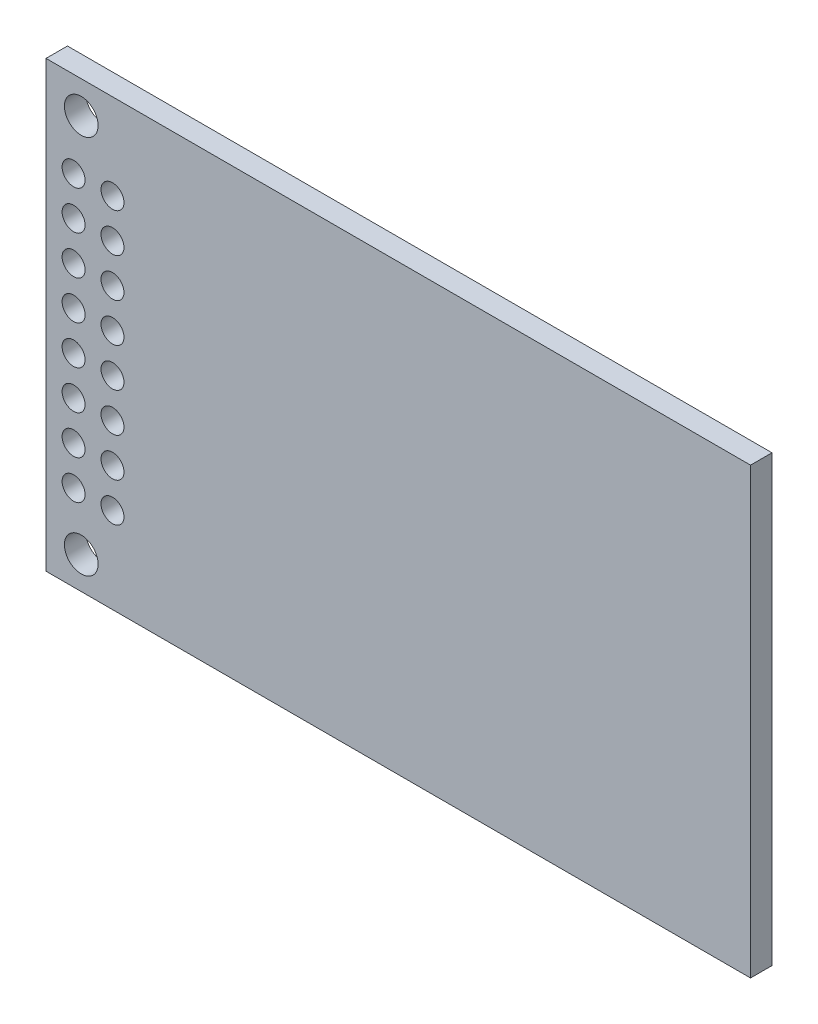
ISO-10303-21;
HEADER;
FILE_DESCRIPTION(('STEP AP214'),'2;1');
FILE_NAME('part.step','',(''),(''),'','','');
FILE_SCHEMA(('AUTOMOTIVE_DESIGN { 1 0 10303 214 1 1 1 1 }'));
ENDSEC;
DATA;
#1=APPLICATION_CONTEXT('core data for automotive mechanical design processes');
#2=APPLICATION_PROTOCOL_DEFINITION('international standard','automotive_design',2000,#1);
#3=PRODUCT_CONTEXT('',#1,'mechanical');
#4=PRODUCT('Part','Part','',(#3));
#5=PRODUCT_RELATED_PRODUCT_CATEGORY('part','',(#4));
#6=PRODUCT_DEFINITION_FORMATION('','',#4);
#7=PRODUCT_DEFINITION_CONTEXT('part definition',#1,'design');
#8=PRODUCT_DEFINITION('design','',#6,#7);
#9=PRODUCT_DEFINITION_SHAPE('','',#8);
#10=(LENGTH_UNIT() NAMED_UNIT(*) SI_UNIT(.MILLI.,.METRE.));
#11=(NAMED_UNIT(*) PLANE_ANGLE_UNIT() SI_UNIT($,.RADIAN.));
#12=(NAMED_UNIT(*) SI_UNIT($,.STERADIAN.) SOLID_ANGLE_UNIT());
#13=UNCERTAINTY_MEASURE_WITH_UNIT(LENGTH_MEASURE(1.E-05),#10,'distance_accuracy_value','');
#14=(GEOMETRIC_REPRESENTATION_CONTEXT(3) GLOBAL_UNCERTAINTY_ASSIGNED_CONTEXT((#13)) GLOBAL_UNIT_ASSIGNED_CONTEXT((#10,
#11,#12)) REPRESENTATION_CONTEXT('',''));
#15=CARTESIAN_POINT('',(0.,0.,0.));
#16=DIRECTION('',(0.,0.,1.));
#17=DIRECTION('',(1.,0.,0.));
#18=AXIS2_PLACEMENT_3D('',#15,#16,#17);
#19=CARTESIAN_POINT('',(23.,-14.5,1.4));
#20=DIRECTION('',(-1.,0.,0.));
#21=DIRECTION('',(0.,0.,1.));
#22=AXIS2_PLACEMENT_3D('',#19,#20,#21);
#23=PLANE('',#22);
#24=DIRECTION('',(0.,1.,0.));
#25=VECTOR('',#24,1.);
#26=CARTESIAN_POINT('',(23.,-14.5,0.));
#27=LINE('',#26,#25);
#28=CARTESIAN_POINT('',(23.,-14.5,0.));
#29=VERTEX_POINT('',#28);
#30=CARTESIAN_POINT('',(23.,14.5,0.));
#31=VERTEX_POINT('',#30);
#32=EDGE_CURVE('E101',#29,#31,#27,.T.);
#33=ORIENTED_EDGE('',*,*,#32,.T.);
#34=DIRECTION('',(0.,0.,-1.));
#35=VECTOR('',#34,1.);
#36=CARTESIAN_POINT('',(23.,14.5,1.4));
#37=LINE('',#36,#35);
#38=CARTESIAN_POINT('',(23.,14.5,1.4));
#39=VERTEX_POINT('',#38);
#40=EDGE_CURVE('E11',#39,#31,#37,.T.);
#41=ORIENTED_EDGE('',*,*,#40,.F.);
#42=DIRECTION('',(0.,1.,0.));
#43=VECTOR('',#42,1.);
#44=CARTESIAN_POINT('',(23.,-14.5,1.4));
#45=LINE('',#44,#43);
#46=CARTESIAN_POINT('',(23.,-14.5,1.4));
#47=VERTEX_POINT('',#46);
#48=EDGE_CURVE('E89',#47,#39,#45,.T.);
#49=ORIENTED_EDGE('',*,*,#48,.F.);
#50=DIRECTION('',(0.,0.,-1.));
#51=VECTOR('',#50,1.);
#52=CARTESIAN_POINT('',(23.,-14.5,1.4));
#53=LINE('',#52,#51);
#54=EDGE_CURVE('E97',#47,#29,#53,.T.);
#55=ORIENTED_EDGE('',*,*,#54,.T.);
#56=EDGE_LOOP('',(#33,#41,#49,#55));
#57=FACE_BOUND('',#56,.T.);
#58=ADVANCED_FACE('F38',(#57),#23,.F.);
#59=CARTESIAN_POINT('',(-23.,14.5,1.4));
#60=DIRECTION('',(0.,-1.,0.));
#61=DIRECTION('',(0.,0.,-1.));
#62=AXIS2_PLACEMENT_3D('',#59,#60,#61);
#63=PLANE('',#62);
#64=DIRECTION('',(-1.,0.,0.));
#65=VECTOR('',#64,1.);
#66=CARTESIAN_POINT('',(-23.,14.5,0.));
#67=LINE('',#66,#65);
#68=CARTESIAN_POINT('',(-23.,14.5,0.));
#69=VERTEX_POINT('',#68);
#70=EDGE_CURVE('E93',#31,#69,#67,.T.);
#71=ORIENTED_EDGE('',*,*,#70,.T.);
#72=DIRECTION('',(0.,0.,-1.));
#73=VECTOR('',#72,1.);
#74=CARTESIAN_POINT('',(-23.,14.5,1.4));
#75=LINE('',#74,#73);
#76=CARTESIAN_POINT('',(-23.,14.5,1.4));
#77=VERTEX_POINT('',#76);
#78=EDGE_CURVE('E46',#77,#69,#75,.T.);
#79=ORIENTED_EDGE('',*,*,#78,.F.);
#80=DIRECTION('',(-1.,0.,0.));
#81=VECTOR('',#80,1.);
#82=CARTESIAN_POINT('',(-23.,14.5,1.4));
#83=LINE('',#82,#81);
#84=EDGE_CURVE('E84',#39,#77,#83,.T.);
#85=ORIENTED_EDGE('',*,*,#84,.F.);
#86=ORIENTED_EDGE('',*,*,#40,.T.);
#87=EDGE_LOOP('',(#71,#79,#85,#86));
#88=FACE_BOUND('',#87,.T.);
#89=ADVANCED_FACE('F92',(#88),#63,.F.);
#90=CARTESIAN_POINT('',(-23.,-14.5,1.4));
#91=DIRECTION('',(1.,0.,0.));
#92=DIRECTION('',(0.,0.,-1.));
#93=AXIS2_PLACEMENT_3D('',#90,#91,#92);
#94=PLANE('',#93);
#95=DIRECTION('',(0.,-1.,0.));
#96=VECTOR('',#95,1.);
#97=CARTESIAN_POINT('',(-23.,-14.5,0.));
#98=LINE('',#97,#96);
#99=CARTESIAN_POINT('',(-23.,-14.5,0.));
#100=VERTEX_POINT('',#99);
#101=EDGE_CURVE('E71',#69,#100,#98,.T.);
#102=ORIENTED_EDGE('',*,*,#101,.T.);
#103=DIRECTION('',(0.,0.,-1.));
#104=VECTOR('',#103,1.);
#105=CARTESIAN_POINT('',(-23.,-14.5,1.4));
#106=LINE('',#105,#104);
#107=CARTESIAN_POINT('',(-23.,-14.5,1.4));
#108=VERTEX_POINT('',#107);
#109=EDGE_CURVE('E94',#108,#100,#106,.T.);
#110=ORIENTED_EDGE('',*,*,#109,.F.);
#111=DIRECTION('',(0.,-1.,0.));
#112=VECTOR('',#111,1.);
#113=CARTESIAN_POINT('',(-23.,-14.5,1.4));
#114=LINE('',#113,#112);
#115=EDGE_CURVE('E87',#77,#108,#114,.T.);
#116=ORIENTED_EDGE('',*,*,#115,.F.);
#117=ORIENTED_EDGE('',*,*,#78,.T.);
#118=EDGE_LOOP('',(#102,#110,#116,#117));
#119=FACE_BOUND('',#118,.T.);
#120=ADVANCED_FACE('F95',(#119),#94,.F.);
#121=CARTESIAN_POINT('',(-23.,-14.5,1.4));
#122=DIRECTION('',(0.,1.,0.));
#123=DIRECTION('',(0.,0.,1.));
#124=AXIS2_PLACEMENT_3D('',#121,#122,#123);
#125=PLANE('',#124);
#126=DIRECTION('',(1.,0.,0.));
#127=VECTOR('',#126,1.);
#128=CARTESIAN_POINT('',(-23.,-14.5,0.));
#129=LINE('',#128,#127);
#130=EDGE_CURVE('E77',#100,#29,#129,.T.);
#131=ORIENTED_EDGE('',*,*,#130,.T.);
#132=ORIENTED_EDGE('',*,*,#54,.F.);
#133=DIRECTION('',(1.,0.,0.));
#134=VECTOR('',#133,1.);
#135=CARTESIAN_POINT('',(-23.,-14.5,1.4));
#136=LINE('',#135,#134);
#137=EDGE_CURVE('E54',#108,#47,#136,.T.);
#138=ORIENTED_EDGE('',*,*,#137,.F.);
#139=ORIENTED_EDGE('',*,*,#109,.T.);
#140=EDGE_LOOP('',(#131,#132,#138,#139));
#141=FACE_BOUND('',#140,.T.);
#142=ADVANCED_FACE('F109',(#141),#125,.F.);
#143=CARTESIAN_POINT('',(0.,0.,1.4));
#144=DIRECTION('',(0.,0.,-1.));
#145=DIRECTION('',(-1.,0.,0.));
#146=AXIS2_PLACEMENT_3D('',#143,#144,#145);
#147=PLANE('',#146);
#148=CARTESIAN_POINT('',(-21.2,-8.89,1.4));
#149=DIRECTION('',(0.,0.,1.));
#150=DIRECTION('',(1.,0.,0.));
#151=AXIS2_PLACEMENT_3D('',#148,#149,#150);
#152=CIRCLE('',#151,0.750000000000002);
#153=CARTESIAN_POINT('',(-20.45,-8.89,1.4));
#154=VERTEX_POINT('',#153);
#155=EDGE_CURVE('E217',#154,#154,#152,.T.);
#156=ORIENTED_EDGE('',*,*,#155,.F.);
#157=EDGE_LOOP('',(#156));
#158=FACE_BOUND('',#157,.T.);
#159=CARTESIAN_POINT('',(-21.2,-6.35,1.4));
#160=DIRECTION('',(0.,0.,1.));
#161=DIRECTION('',(1.,0.,0.));
#162=AXIS2_PLACEMENT_3D('',#159,#160,#161);
#163=CIRCLE('',#162,0.750000000000002);
#164=CARTESIAN_POINT('',(-20.45,-6.35,1.4));
#165=VERTEX_POINT('',#164);
#166=EDGE_CURVE('E211',#165,#165,#163,.T.);
#167=ORIENTED_EDGE('',*,*,#166,.F.);
#168=EDGE_LOOP('',(#167));
#169=FACE_BOUND('',#168,.T.);
#170=CARTESIAN_POINT('',(-21.2,-3.81,1.4));
#171=DIRECTION('',(0.,0.,1.));
#172=DIRECTION('',(1.,0.,0.));
#173=AXIS2_PLACEMENT_3D('',#170,#171,#172);
#174=CIRCLE('',#173,0.750000000000002);
#175=CARTESIAN_POINT('',(-20.45,-3.81,1.4));
#176=VERTEX_POINT('',#175);
#177=EDGE_CURVE('E205',#176,#176,#174,.T.);
#178=ORIENTED_EDGE('',*,*,#177,.F.);
#179=EDGE_LOOP('',(#178));
#180=FACE_BOUND('',#179,.T.);
#181=CARTESIAN_POINT('',(-21.2,-1.27,1.4));
#182=DIRECTION('',(0.,0.,1.));
#183=DIRECTION('',(1.,0.,0.));
#184=AXIS2_PLACEMENT_3D('',#181,#182,#183);
#185=CIRCLE('',#184,0.750000000000002);
#186=CARTESIAN_POINT('',(-20.45,-1.27,1.4));
#187=VERTEX_POINT('',#186);
#188=EDGE_CURVE('E199',#187,#187,#185,.T.);
#189=ORIENTED_EDGE('',*,*,#188,.F.);
#190=EDGE_LOOP('',(#189));
#191=FACE_BOUND('',#190,.T.);
#192=CARTESIAN_POINT('',(-21.2,1.27,1.4));
#193=DIRECTION('',(0.,0.,1.));
#194=DIRECTION('',(1.,0.,0.));
#195=AXIS2_PLACEMENT_3D('',#192,#193,#194);
#196=CIRCLE('',#195,0.750000000000002);
#197=CARTESIAN_POINT('',(-20.45,1.27,1.4));
#198=VERTEX_POINT('',#197);
#199=EDGE_CURVE('E193',#198,#198,#196,.T.);
#200=ORIENTED_EDGE('',*,*,#199,.F.);
#201=EDGE_LOOP('',(#200));
#202=FACE_BOUND('',#201,.T.);
#203=CARTESIAN_POINT('',(-21.2,3.81,1.4));
#204=DIRECTION('',(0.,0.,1.));
#205=DIRECTION('',(1.,0.,0.));
#206=AXIS2_PLACEMENT_3D('',#203,#204,#205);
#207=CIRCLE('',#206,0.750000000000002);
#208=CARTESIAN_POINT('',(-20.45,3.81,1.4));
#209=VERTEX_POINT('',#208);
#210=EDGE_CURVE('E187',#209,#209,#207,.T.);
#211=ORIENTED_EDGE('',*,*,#210,.F.);
#212=EDGE_LOOP('',(#211));
#213=FACE_BOUND('',#212,.T.);
#214=CARTESIAN_POINT('',(-21.2,6.35,1.4));
#215=DIRECTION('',(0.,0.,1.));
#216=DIRECTION('',(1.,0.,0.));
#217=AXIS2_PLACEMENT_3D('',#214,#215,#216);
#218=CIRCLE('',#217,0.750000000000002);
#219=CARTESIAN_POINT('',(-20.45,6.35,1.4));
#220=VERTEX_POINT('',#219);
#221=EDGE_CURVE('E181',#220,#220,#218,.T.);
#222=ORIENTED_EDGE('',*,*,#221,.F.);
#223=EDGE_LOOP('',(#222));
#224=FACE_BOUND('',#223,.T.);
#225=CARTESIAN_POINT('',(-18.66,-8.89,1.4));
#226=DIRECTION('',(0.,0.,1.));
#227=DIRECTION('',(1.,0.,0.));
#228=AXIS2_PLACEMENT_3D('',#225,#226,#227);
#229=CIRCLE('',#228,0.750000000000002);
#230=CARTESIAN_POINT('',(-17.91,-8.89,1.4));
#231=VERTEX_POINT('',#230);
#232=EDGE_CURVE('E175',#231,#231,#229,.T.);
#233=ORIENTED_EDGE('',*,*,#232,.F.);
#234=EDGE_LOOP('',(#233));
#235=FACE_BOUND('',#234,.T.);
#236=CARTESIAN_POINT('',(-18.66,-6.35,1.4));
#237=DIRECTION('',(0.,0.,1.));
#238=DIRECTION('',(1.,0.,0.));
#239=AXIS2_PLACEMENT_3D('',#236,#237,#238);
#240=CIRCLE('',#239,0.750000000000002);
#241=CARTESIAN_POINT('',(-17.91,-6.35,1.4));
#242=VERTEX_POINT('',#241);
#243=EDGE_CURVE('E169',#242,#242,#240,.T.);
#244=ORIENTED_EDGE('',*,*,#243,.F.);
#245=EDGE_LOOP('',(#244));
#246=FACE_BOUND('',#245,.T.);
#247=CARTESIAN_POINT('',(-18.66,-3.81,1.4));
#248=DIRECTION('',(0.,0.,1.));
#249=DIRECTION('',(1.,0.,0.));
#250=AXIS2_PLACEMENT_3D('',#247,#248,#249);
#251=CIRCLE('',#250,0.750000000000002);
#252=CARTESIAN_POINT('',(-17.91,-3.81,1.4));
#253=VERTEX_POINT('',#252);
#254=EDGE_CURVE('E163',#253,#253,#251,.T.);
#255=ORIENTED_EDGE('',*,*,#254,.F.);
#256=EDGE_LOOP('',(#255));
#257=FACE_BOUND('',#256,.T.);
#258=CARTESIAN_POINT('',(-18.66,-1.27,1.4));
#259=DIRECTION('',(0.,0.,1.));
#260=DIRECTION('',(1.,0.,0.));
#261=AXIS2_PLACEMENT_3D('',#258,#259,#260);
#262=CIRCLE('',#261,0.750000000000002);
#263=CARTESIAN_POINT('',(-17.91,-1.27,1.4));
#264=VERTEX_POINT('',#263);
#265=EDGE_CURVE('E157',#264,#264,#262,.T.);
#266=ORIENTED_EDGE('',*,*,#265,.F.);
#267=EDGE_LOOP('',(#266));
#268=FACE_BOUND('',#267,.T.);
#269=CARTESIAN_POINT('',(-18.66,1.27,1.4));
#270=DIRECTION('',(0.,0.,1.));
#271=DIRECTION('',(1.,0.,0.));
#272=AXIS2_PLACEMENT_3D('',#269,#270,#271);
#273=CIRCLE('',#272,0.750000000000006);
#274=CARTESIAN_POINT('',(-17.91,1.27,1.4));
#275=VERTEX_POINT('',#274);
#276=EDGE_CURVE('E151',#275,#275,#273,.T.);
#277=ORIENTED_EDGE('',*,*,#276,.F.);
#278=EDGE_LOOP('',(#277));
#279=FACE_BOUND('',#278,.T.);
#280=CARTESIAN_POINT('',(-18.66,3.81,1.4));
#281=DIRECTION('',(0.,0.,1.));
#282=DIRECTION('',(1.,0.,0.));
#283=AXIS2_PLACEMENT_3D('',#280,#281,#282);
#284=CIRCLE('',#283,0.750000000000002);
#285=CARTESIAN_POINT('',(-17.91,3.81,1.4));
#286=VERTEX_POINT('',#285);
#287=EDGE_CURVE('E145',#286,#286,#284,.T.);
#288=ORIENTED_EDGE('',*,*,#287,.F.);
#289=EDGE_LOOP('',(#288));
#290=FACE_BOUND('',#289,.T.);
#291=CARTESIAN_POINT('',(-18.66,6.35,1.4));
#292=DIRECTION('',(0.,0.,1.));
#293=DIRECTION('',(1.,0.,0.));
#294=AXIS2_PLACEMENT_3D('',#291,#292,#293);
#295=CIRCLE('',#294,0.750000000000002);
#296=CARTESIAN_POINT('',(-17.91,6.35,1.4));
#297=VERTEX_POINT('',#296);
#298=EDGE_CURVE('E139',#297,#297,#295,.T.);
#299=ORIENTED_EDGE('',*,*,#298,.F.);
#300=EDGE_LOOP('',(#299));
#301=FACE_BOUND('',#300,.T.);
#302=CARTESIAN_POINT('',(-18.66,8.89,1.4));
#303=DIRECTION('',(0.,0.,1.));
#304=DIRECTION('',(1.,0.,0.));
#305=AXIS2_PLACEMENT_3D('',#302,#303,#304);
#306=CIRCLE('',#305,0.750000000000002);
#307=CARTESIAN_POINT('',(-17.91,8.89,1.4));
#308=VERTEX_POINT('',#307);
#309=EDGE_CURVE('E133',#308,#308,#306,.T.);
#310=ORIENTED_EDGE('',*,*,#309,.F.);
#311=EDGE_LOOP('',(#310));
#312=FACE_BOUND('',#311,.T.);
#313=CARTESIAN_POINT('',(-21.2,8.89,1.4));
#314=DIRECTION('',(0.,0.,1.));
#315=DIRECTION('',(1.,0.,0.));
#316=AXIS2_PLACEMENT_3D('',#313,#314,#315);
#317=CIRCLE('',#316,0.750000000000002);
#318=CARTESIAN_POINT('',(-20.45,8.89,1.4));
#319=VERTEX_POINT('',#318);
#320=EDGE_CURVE('E127',#319,#319,#317,.T.);
#321=ORIENTED_EDGE('',*,*,#320,.F.);
#322=EDGE_LOOP('',(#321));
#323=FACE_BOUND('',#322,.T.);
#324=CARTESIAN_POINT('',(-20.7,-12.4,1.4));
#325=DIRECTION('',(0.,0.,1.));
#326=DIRECTION('',(-1.,0.,0.));
#327=AXIS2_PLACEMENT_3D('',#324,#325,#326);
#328=CIRCLE('',#327,1.1);
#329=CARTESIAN_POINT('',(-21.8,-12.4,1.4));
#330=VERTEX_POINT('',#329);
#331=EDGE_CURVE('E121',#330,#330,#328,.T.);
#332=ORIENTED_EDGE('',*,*,#331,.F.);
#333=EDGE_LOOP('',(#332));
#334=FACE_BOUND('',#333,.T.);
#335=CARTESIAN_POINT('',(-20.7,12.4,1.4));
#336=DIRECTION('',(0.,0.,1.));
#337=DIRECTION('',(1.,0.,0.));
#338=AXIS2_PLACEMENT_3D('',#335,#336,#337);
#339=CIRCLE('',#338,1.1);
#340=CARTESIAN_POINT('',(-19.6,12.4,1.4));
#341=VERTEX_POINT('',#340);
#342=EDGE_CURVE('E115',#341,#341,#339,.T.);
#343=ORIENTED_EDGE('',*,*,#342,.F.);
#344=EDGE_LOOP('',(#343));
#345=FACE_BOUND('',#344,.T.);
#346=ORIENTED_EDGE('',*,*,#48,.T.);
#347=ORIENTED_EDGE('',*,*,#84,.T.);
#348=ORIENTED_EDGE('',*,*,#115,.T.);
#349=ORIENTED_EDGE('',*,*,#137,.T.);
#350=EDGE_LOOP('',(#346,#347,#348,#349));
#351=FACE_BOUND('',#350,.T.);
#352=ADVANCED_FACE('F85',(#158,#169,#180,#191,#202,#213,#224,#235,#246,#257,#268,#279,#290,#301,
#312,#323,#334,#345,#351),#147,.F.);
#353=CARTESIAN_POINT('',(0.,0.,0.));
#354=DIRECTION('',(0.,0.,-1.));
#355=DIRECTION('',(-1.,0.,0.));
#356=AXIS2_PLACEMENT_3D('',#353,#354,#355);
#357=PLANE('',#356);
#358=CARTESIAN_POINT('',(-21.2,-8.89,0.));
#359=DIRECTION('',(0.,0.,1.));
#360=DIRECTION('',(1.,0.,0.));
#361=AXIS2_PLACEMENT_3D('',#358,#359,#360);
#362=CIRCLE('',#361,0.750000000000002);
#363=CARTESIAN_POINT('',(-20.45,-8.89,0.));
#364=VERTEX_POINT('',#363);
#365=EDGE_CURVE('E214',#364,#364,#362,.T.);
#366=ORIENTED_EDGE('',*,*,#365,.T.);
#367=EDGE_LOOP('',(#366));
#368=FACE_BOUND('',#367,.T.);
#369=CARTESIAN_POINT('',(-21.2,-6.35,0.));
#370=DIRECTION('',(0.,0.,1.));
#371=DIRECTION('',(1.,0.,0.));
#372=AXIS2_PLACEMENT_3D('',#369,#370,#371);
#373=CIRCLE('',#372,0.750000000000002);
#374=CARTESIAN_POINT('',(-20.45,-6.35,0.));
#375=VERTEX_POINT('',#374);
#376=EDGE_CURVE('E208',#375,#375,#373,.T.);
#377=ORIENTED_EDGE('',*,*,#376,.T.);
#378=EDGE_LOOP('',(#377));
#379=FACE_BOUND('',#378,.T.);
#380=CARTESIAN_POINT('',(-21.2,-3.81,0.));
#381=DIRECTION('',(0.,0.,1.));
#382=DIRECTION('',(1.,0.,0.));
#383=AXIS2_PLACEMENT_3D('',#380,#381,#382);
#384=CIRCLE('',#383,0.750000000000002);
#385=CARTESIAN_POINT('',(-20.45,-3.81,0.));
#386=VERTEX_POINT('',#385);
#387=EDGE_CURVE('E202',#386,#386,#384,.T.);
#388=ORIENTED_EDGE('',*,*,#387,.T.);
#389=EDGE_LOOP('',(#388));
#390=FACE_BOUND('',#389,.T.);
#391=CARTESIAN_POINT('',(-21.2,-1.27,0.));
#392=DIRECTION('',(0.,0.,1.));
#393=DIRECTION('',(1.,0.,0.));
#394=AXIS2_PLACEMENT_3D('',#391,#392,#393);
#395=CIRCLE('',#394,0.750000000000002);
#396=CARTESIAN_POINT('',(-20.45,-1.27,0.));
#397=VERTEX_POINT('',#396);
#398=EDGE_CURVE('E196',#397,#397,#395,.T.);
#399=ORIENTED_EDGE('',*,*,#398,.T.);
#400=EDGE_LOOP('',(#399));
#401=FACE_BOUND('',#400,.T.);
#402=CARTESIAN_POINT('',(-21.2,1.27,0.));
#403=DIRECTION('',(0.,0.,1.));
#404=DIRECTION('',(1.,0.,0.));
#405=AXIS2_PLACEMENT_3D('',#402,#403,#404);
#406=CIRCLE('',#405,0.750000000000002);
#407=CARTESIAN_POINT('',(-20.45,1.27,0.));
#408=VERTEX_POINT('',#407);
#409=EDGE_CURVE('E190',#408,#408,#406,.T.);
#410=ORIENTED_EDGE('',*,*,#409,.T.);
#411=EDGE_LOOP('',(#410));
#412=FACE_BOUND('',#411,.T.);
#413=CARTESIAN_POINT('',(-21.2,3.81,0.));
#414=DIRECTION('',(0.,0.,1.));
#415=DIRECTION('',(1.,0.,0.));
#416=AXIS2_PLACEMENT_3D('',#413,#414,#415);
#417=CIRCLE('',#416,0.750000000000002);
#418=CARTESIAN_POINT('',(-20.45,3.81,0.));
#419=VERTEX_POINT('',#418);
#420=EDGE_CURVE('E184',#419,#419,#417,.T.);
#421=ORIENTED_EDGE('',*,*,#420,.T.);
#422=EDGE_LOOP('',(#421));
#423=FACE_BOUND('',#422,.T.);
#424=CARTESIAN_POINT('',(-21.2,6.35,0.));
#425=DIRECTION('',(0.,0.,1.));
#426=DIRECTION('',(1.,0.,0.));
#427=AXIS2_PLACEMENT_3D('',#424,#425,#426);
#428=CIRCLE('',#427,0.750000000000002);
#429=CARTESIAN_POINT('',(-20.45,6.35,0.));
#430=VERTEX_POINT('',#429);
#431=EDGE_CURVE('E178',#430,#430,#428,.T.);
#432=ORIENTED_EDGE('',*,*,#431,.T.);
#433=EDGE_LOOP('',(#432));
#434=FACE_BOUND('',#433,.T.);
#435=CARTESIAN_POINT('',(-18.66,-8.89,0.));
#436=DIRECTION('',(0.,0.,1.));
#437=DIRECTION('',(1.,0.,0.));
#438=AXIS2_PLACEMENT_3D('',#435,#436,#437);
#439=CIRCLE('',#438,0.750000000000002);
#440=CARTESIAN_POINT('',(-17.91,-8.89,0.));
#441=VERTEX_POINT('',#440);
#442=EDGE_CURVE('E172',#441,#441,#439,.T.);
#443=ORIENTED_EDGE('',*,*,#442,.T.);
#444=EDGE_LOOP('',(#443));
#445=FACE_BOUND('',#444,.T.);
#446=CARTESIAN_POINT('',(-18.66,-6.35,0.));
#447=DIRECTION('',(0.,0.,1.));
#448=DIRECTION('',(1.,0.,0.));
#449=AXIS2_PLACEMENT_3D('',#446,#447,#448);
#450=CIRCLE('',#449,0.750000000000002);
#451=CARTESIAN_POINT('',(-17.91,-6.35,0.));
#452=VERTEX_POINT('',#451);
#453=EDGE_CURVE('E166',#452,#452,#450,.T.);
#454=ORIENTED_EDGE('',*,*,#453,.T.);
#455=EDGE_LOOP('',(#454));
#456=FACE_BOUND('',#455,.T.);
#457=CARTESIAN_POINT('',(-18.66,-3.81,0.));
#458=DIRECTION('',(0.,0.,1.));
#459=DIRECTION('',(1.,0.,0.));
#460=AXIS2_PLACEMENT_3D('',#457,#458,#459);
#461=CIRCLE('',#460,0.750000000000002);
#462=CARTESIAN_POINT('',(-17.91,-3.81,0.));
#463=VERTEX_POINT('',#462);
#464=EDGE_CURVE('E160',#463,#463,#461,.T.);
#465=ORIENTED_EDGE('',*,*,#464,.T.);
#466=EDGE_LOOP('',(#465));
#467=FACE_BOUND('',#466,.T.);
#468=CARTESIAN_POINT('',(-18.66,-1.27,0.));
#469=DIRECTION('',(0.,0.,1.));
#470=DIRECTION('',(1.,0.,0.));
#471=AXIS2_PLACEMENT_3D('',#468,#469,#470);
#472=CIRCLE('',#471,0.750000000000002);
#473=CARTESIAN_POINT('',(-17.91,-1.27,0.));
#474=VERTEX_POINT('',#473);
#475=EDGE_CURVE('E154',#474,#474,#472,.T.);
#476=ORIENTED_EDGE('',*,*,#475,.T.);
#477=EDGE_LOOP('',(#476));
#478=FACE_BOUND('',#477,.T.);
#479=CARTESIAN_POINT('',(-18.66,1.27,0.));
#480=DIRECTION('',(0.,0.,1.));
#481=DIRECTION('',(1.,0.,0.));
#482=AXIS2_PLACEMENT_3D('',#479,#480,#481);
#483=CIRCLE('',#482,0.750000000000006);
#484=CARTESIAN_POINT('',(-17.91,1.27,0.));
#485=VERTEX_POINT('',#484);
#486=EDGE_CURVE('E148',#485,#485,#483,.T.);
#487=ORIENTED_EDGE('',*,*,#486,.T.);
#488=EDGE_LOOP('',(#487));
#489=FACE_BOUND('',#488,.T.);
#490=CARTESIAN_POINT('',(-18.66,3.81,0.));
#491=DIRECTION('',(0.,0.,1.));
#492=DIRECTION('',(1.,0.,0.));
#493=AXIS2_PLACEMENT_3D('',#490,#491,#492);
#494=CIRCLE('',#493,0.750000000000002);
#495=CARTESIAN_POINT('',(-17.91,3.81,0.));
#496=VERTEX_POINT('',#495);
#497=EDGE_CURVE('E142',#496,#496,#494,.T.);
#498=ORIENTED_EDGE('',*,*,#497,.T.);
#499=EDGE_LOOP('',(#498));
#500=FACE_BOUND('',#499,.T.);
#501=CARTESIAN_POINT('',(-18.66,6.35,0.));
#502=DIRECTION('',(0.,0.,1.));
#503=DIRECTION('',(1.,0.,0.));
#504=AXIS2_PLACEMENT_3D('',#501,#502,#503);
#505=CIRCLE('',#504,0.750000000000002);
#506=CARTESIAN_POINT('',(-17.91,6.35,0.));
#507=VERTEX_POINT('',#506);
#508=EDGE_CURVE('E136',#507,#507,#505,.T.);
#509=ORIENTED_EDGE('',*,*,#508,.T.);
#510=EDGE_LOOP('',(#509));
#511=FACE_BOUND('',#510,.T.);
#512=CARTESIAN_POINT('',(-18.66,8.89,0.));
#513=DIRECTION('',(0.,0.,1.));
#514=DIRECTION('',(1.,0.,0.));
#515=AXIS2_PLACEMENT_3D('',#512,#513,#514);
#516=CIRCLE('',#515,0.750000000000002);
#517=CARTESIAN_POINT('',(-17.91,8.89,0.));
#518=VERTEX_POINT('',#517);
#519=EDGE_CURVE('E130',#518,#518,#516,.T.);
#520=ORIENTED_EDGE('',*,*,#519,.T.);
#521=EDGE_LOOP('',(#520));
#522=FACE_BOUND('',#521,.T.);
#523=CARTESIAN_POINT('',(-21.2,8.89,0.));
#524=DIRECTION('',(0.,0.,1.));
#525=DIRECTION('',(1.,0.,0.));
#526=AXIS2_PLACEMENT_3D('',#523,#524,#525);
#527=CIRCLE('',#526,0.750000000000002);
#528=CARTESIAN_POINT('',(-20.45,8.89,0.));
#529=VERTEX_POINT('',#528);
#530=EDGE_CURVE('E124',#529,#529,#527,.T.);
#531=ORIENTED_EDGE('',*,*,#530,.T.);
#532=EDGE_LOOP('',(#531));
#533=FACE_BOUND('',#532,.T.);
#534=CARTESIAN_POINT('',(-20.7,-12.4,0.));
#535=DIRECTION('',(0.,0.,1.));
#536=DIRECTION('',(-1.,0.,0.));
#537=AXIS2_PLACEMENT_3D('',#534,#535,#536);
#538=CIRCLE('',#537,1.1);
#539=CARTESIAN_POINT('',(-21.8,-12.4,0.));
#540=VERTEX_POINT('',#539);
#541=EDGE_CURVE('E118',#540,#540,#538,.T.);
#542=ORIENTED_EDGE('',*,*,#541,.T.);
#543=EDGE_LOOP('',(#542));
#544=FACE_BOUND('',#543,.T.);
#545=CARTESIAN_POINT('',(-20.7,12.4,0.));
#546=DIRECTION('',(0.,0.,1.));
#547=DIRECTION('',(1.,0.,0.));
#548=AXIS2_PLACEMENT_3D('',#545,#546,#547);
#549=CIRCLE('',#548,1.1);
#550=CARTESIAN_POINT('',(-19.6,12.4,0.));
#551=VERTEX_POINT('',#550);
#552=EDGE_CURVE('E104',#551,#551,#549,.T.);
#553=ORIENTED_EDGE('',*,*,#552,.T.);
#554=EDGE_LOOP('',(#553));
#555=FACE_BOUND('',#554,.T.);
#556=ORIENTED_EDGE('',*,*,#32,.F.);
#557=ORIENTED_EDGE('',*,*,#130,.F.);
#558=ORIENTED_EDGE('',*,*,#101,.F.);
#559=ORIENTED_EDGE('',*,*,#70,.F.);
#560=EDGE_LOOP('',(#556,#557,#558,#559));
#561=FACE_BOUND('',#560,.T.);
#562=ADVANCED_FACE('F112',(#368,#379,#390,#401,#412,#423,#434,#445,#456,#467,#478,#489,#500,
#511,#522,#533,#544,#555,#561),#357,.T.);
#563=CARTESIAN_POINT('',(-20.7,12.4,0.));
#564=DIRECTION('',(0.,0.,1.));
#565=DIRECTION('',(1.,0.,0.));
#566=AXIS2_PLACEMENT_3D('',#563,#564,#565);
#567=CYLINDRICAL_SURFACE('',#566,1.1);
#568=ORIENTED_EDGE('',*,*,#552,.F.);
#569=EDGE_LOOP('',(#568));
#570=FACE_BOUND('',#569,.T.);
#571=ORIENTED_EDGE('',*,*,#342,.T.);
#572=EDGE_LOOP('',(#571));
#573=FACE_BOUND('',#572,.T.);
#574=ADVANCED_FACE('F269',(#570,#573),#567,.F.);
#575=CARTESIAN_POINT('',(-20.7,-12.4,0.));
#576=DIRECTION('',(0.,0.,1.));
#577=DIRECTION('',(1.,0.,0.));
#578=AXIS2_PLACEMENT_3D('',#575,#576,#577);
#579=CYLINDRICAL_SURFACE('',#578,1.1);
#580=ORIENTED_EDGE('',*,*,#541,.F.);
#581=EDGE_LOOP('',(#580));
#582=FACE_BOUND('',#581,.T.);
#583=ORIENTED_EDGE('',*,*,#331,.T.);
#584=EDGE_LOOP('',(#583));
#585=FACE_BOUND('',#584,.T.);
#586=ADVANCED_FACE('F271',(#582,#585),#579,.F.);
#587=CARTESIAN_POINT('',(-21.2,8.89,0.));
#588=DIRECTION('',(0.,0.,1.));
#589=DIRECTION('',(1.,0.,0.));
#590=AXIS2_PLACEMENT_3D('',#587,#588,#589);
#591=CYLINDRICAL_SURFACE('',#590,0.750000000000002);
#592=ORIENTED_EDGE('',*,*,#530,.F.);
#593=EDGE_LOOP('',(#592));
#594=FACE_BOUND('',#593,.T.);
#595=ORIENTED_EDGE('',*,*,#320,.T.);
#596=EDGE_LOOP('',(#595));
#597=FACE_BOUND('',#596,.T.);
#598=ADVANCED_FACE('F278',(#594,#597),#591,.F.);
#599=CARTESIAN_POINT('',(-18.66,8.89,0.));
#600=DIRECTION('',(0.,0.,1.));
#601=DIRECTION('',(1.,0.,0.));
#602=AXIS2_PLACEMENT_3D('',#599,#600,#601);
#603=CYLINDRICAL_SURFACE('',#602,0.750000000000002);
#604=ORIENTED_EDGE('',*,*,#519,.F.);
#605=EDGE_LOOP('',(#604));
#606=FACE_BOUND('',#605,.T.);
#607=ORIENTED_EDGE('',*,*,#309,.T.);
#608=EDGE_LOOP('',(#607));
#609=FACE_BOUND('',#608,.T.);
#610=ADVANCED_FACE('F324',(#606,#609),#603,.F.);
#611=CARTESIAN_POINT('',(-18.66,6.35,0.));
#612=DIRECTION('',(0.,0.,1.));
#613=DIRECTION('',(1.,0.,0.));
#614=AXIS2_PLACEMENT_3D('',#611,#612,#613);
#615=CYLINDRICAL_SURFACE('',#614,0.750000000000002);
#616=ORIENTED_EDGE('',*,*,#508,.F.);
#617=EDGE_LOOP('',(#616));
#618=FACE_BOUND('',#617,.T.);
#619=ORIENTED_EDGE('',*,*,#298,.T.);
#620=EDGE_LOOP('',(#619));
#621=FACE_BOUND('',#620,.T.);
#622=ADVANCED_FACE('F334',(#618,#621),#615,.F.);
#623=CARTESIAN_POINT('',(-18.66,3.81,0.));
#624=DIRECTION('',(0.,0.,1.));
#625=DIRECTION('',(1.,0.,0.));
#626=AXIS2_PLACEMENT_3D('',#623,#624,#625);
#627=CYLINDRICAL_SURFACE('',#626,0.750000000000002);
#628=ORIENTED_EDGE('',*,*,#497,.F.);
#629=EDGE_LOOP('',(#628));
#630=FACE_BOUND('',#629,.T.);
#631=ORIENTED_EDGE('',*,*,#287,.T.);
#632=EDGE_LOOP('',(#631));
#633=FACE_BOUND('',#632,.T.);
#634=ADVANCED_FACE('F344',(#630,#633),#627,.F.);
#635=CARTESIAN_POINT('',(-18.66,1.27,0.));
#636=DIRECTION('',(0.,0.,1.));
#637=DIRECTION('',(1.,0.,0.));
#638=AXIS2_PLACEMENT_3D('',#635,#636,#637);
#639=CYLINDRICAL_SURFACE('',#638,0.750000000000006);
#640=ORIENTED_EDGE('',*,*,#486,.F.);
#641=EDGE_LOOP('',(#640));
#642=FACE_BOUND('',#641,.T.);
#643=ORIENTED_EDGE('',*,*,#276,.T.);
#644=EDGE_LOOP('',(#643));
#645=FACE_BOUND('',#644,.T.);
#646=ADVANCED_FACE('F354',(#642,#645),#639,.F.);
#647=CARTESIAN_POINT('',(-18.66,-1.27,0.));
#648=DIRECTION('',(0.,0.,1.));
#649=DIRECTION('',(1.,0.,0.));
#650=AXIS2_PLACEMENT_3D('',#647,#648,#649);
#651=CYLINDRICAL_SURFACE('',#650,0.750000000000002);
#652=ORIENTED_EDGE('',*,*,#475,.F.);
#653=EDGE_LOOP('',(#652));
#654=FACE_BOUND('',#653,.T.);
#655=ORIENTED_EDGE('',*,*,#265,.T.);
#656=EDGE_LOOP('',(#655));
#657=FACE_BOUND('',#656,.T.);
#658=ADVANCED_FACE('F364',(#654,#657),#651,.F.);
#659=CARTESIAN_POINT('',(-18.66,-3.81,0.));
#660=DIRECTION('',(0.,0.,1.));
#661=DIRECTION('',(1.,0.,0.));
#662=AXIS2_PLACEMENT_3D('',#659,#660,#661);
#663=CYLINDRICAL_SURFACE('',#662,0.750000000000002);
#664=ORIENTED_EDGE('',*,*,#464,.F.);
#665=EDGE_LOOP('',(#664));
#666=FACE_BOUND('',#665,.T.);
#667=ORIENTED_EDGE('',*,*,#254,.T.);
#668=EDGE_LOOP('',(#667));
#669=FACE_BOUND('',#668,.T.);
#670=ADVANCED_FACE('F374',(#666,#669),#663,.F.);
#671=CARTESIAN_POINT('',(-18.66,-6.35,0.));
#672=DIRECTION('',(0.,0.,1.));
#673=DIRECTION('',(1.,0.,0.));
#674=AXIS2_PLACEMENT_3D('',#671,#672,#673);
#675=CYLINDRICAL_SURFACE('',#674,0.750000000000002);
#676=ORIENTED_EDGE('',*,*,#453,.F.);
#677=EDGE_LOOP('',(#676));
#678=FACE_BOUND('',#677,.T.);
#679=ORIENTED_EDGE('',*,*,#243,.T.);
#680=EDGE_LOOP('',(#679));
#681=FACE_BOUND('',#680,.T.);
#682=ADVANCED_FACE('F384',(#678,#681),#675,.F.);
#683=CARTESIAN_POINT('',(-18.66,-8.89,0.));
#684=DIRECTION('',(0.,0.,1.));
#685=DIRECTION('',(1.,0.,0.));
#686=AXIS2_PLACEMENT_3D('',#683,#684,#685);
#687=CYLINDRICAL_SURFACE('',#686,0.750000000000002);
#688=ORIENTED_EDGE('',*,*,#442,.F.);
#689=EDGE_LOOP('',(#688));
#690=FACE_BOUND('',#689,.T.);
#691=ORIENTED_EDGE('',*,*,#232,.T.);
#692=EDGE_LOOP('',(#691));
#693=FACE_BOUND('',#692,.T.);
#694=ADVANCED_FACE('F394',(#690,#693),#687,.F.);
#695=CARTESIAN_POINT('',(-21.2,6.35,0.));
#696=DIRECTION('',(0.,0.,1.));
#697=DIRECTION('',(1.,0.,0.));
#698=AXIS2_PLACEMENT_3D('',#695,#696,#697);
#699=CYLINDRICAL_SURFACE('',#698,0.750000000000002);
#700=ORIENTED_EDGE('',*,*,#431,.F.);
#701=EDGE_LOOP('',(#700));
#702=FACE_BOUND('',#701,.T.);
#703=ORIENTED_EDGE('',*,*,#221,.T.);
#704=EDGE_LOOP('',(#703));
#705=FACE_BOUND('',#704,.T.);
#706=ADVANCED_FACE('F404',(#702,#705),#699,.F.);
#707=CARTESIAN_POINT('',(-21.2,3.81,0.));
#708=DIRECTION('',(0.,0.,1.));
#709=DIRECTION('',(1.,0.,0.));
#710=AXIS2_PLACEMENT_3D('',#707,#708,#709);
#711=CYLINDRICAL_SURFACE('',#710,0.750000000000002);
#712=ORIENTED_EDGE('',*,*,#420,.F.);
#713=EDGE_LOOP('',(#712));
#714=FACE_BOUND('',#713,.T.);
#715=ORIENTED_EDGE('',*,*,#210,.T.);
#716=EDGE_LOOP('',(#715));
#717=FACE_BOUND('',#716,.T.);
#718=ADVANCED_FACE('F414',(#714,#717),#711,.F.);
#719=CARTESIAN_POINT('',(-21.2,1.27,0.));
#720=DIRECTION('',(0.,0.,1.));
#721=DIRECTION('',(1.,0.,0.));
#722=AXIS2_PLACEMENT_3D('',#719,#720,#721);
#723=CYLINDRICAL_SURFACE('',#722,0.750000000000002);
#724=ORIENTED_EDGE('',*,*,#409,.F.);
#725=EDGE_LOOP('',(#724));
#726=FACE_BOUND('',#725,.T.);
#727=ORIENTED_EDGE('',*,*,#199,.T.);
#728=EDGE_LOOP('',(#727));
#729=FACE_BOUND('',#728,.T.);
#730=ADVANCED_FACE('F424',(#726,#729),#723,.F.);
#731=CARTESIAN_POINT('',(-21.2,-1.27,0.));
#732=DIRECTION('',(0.,0.,1.));
#733=DIRECTION('',(1.,0.,0.));
#734=AXIS2_PLACEMENT_3D('',#731,#732,#733);
#735=CYLINDRICAL_SURFACE('',#734,0.750000000000002);
#736=ORIENTED_EDGE('',*,*,#398,.F.);
#737=EDGE_LOOP('',(#736));
#738=FACE_BOUND('',#737,.T.);
#739=ORIENTED_EDGE('',*,*,#188,.T.);
#740=EDGE_LOOP('',(#739));
#741=FACE_BOUND('',#740,.T.);
#742=ADVANCED_FACE('F434',(#738,#741),#735,.F.);
#743=CARTESIAN_POINT('',(-21.2,-3.81,0.));
#744=DIRECTION('',(0.,0.,1.));
#745=DIRECTION('',(1.,0.,0.));
#746=AXIS2_PLACEMENT_3D('',#743,#744,#745);
#747=CYLINDRICAL_SURFACE('',#746,0.750000000000002);
#748=ORIENTED_EDGE('',*,*,#387,.F.);
#749=EDGE_LOOP('',(#748));
#750=FACE_BOUND('',#749,.T.);
#751=ORIENTED_EDGE('',*,*,#177,.T.);
#752=EDGE_LOOP('',(#751));
#753=FACE_BOUND('',#752,.T.);
#754=ADVANCED_FACE('F444',(#750,#753),#747,.F.);
#755=CARTESIAN_POINT('',(-21.2,-6.35,0.));
#756=DIRECTION('',(0.,0.,1.));
#757=DIRECTION('',(1.,0.,0.));
#758=AXIS2_PLACEMENT_3D('',#755,#756,#757);
#759=CYLINDRICAL_SURFACE('',#758,0.750000000000002);
#760=ORIENTED_EDGE('',*,*,#376,.F.);
#761=EDGE_LOOP('',(#760));
#762=FACE_BOUND('',#761,.T.);
#763=ORIENTED_EDGE('',*,*,#166,.T.);
#764=EDGE_LOOP('',(#763));
#765=FACE_BOUND('',#764,.T.);
#766=ADVANCED_FACE('F228',(#762,#765),#759,.F.);
#767=CARTESIAN_POINT('',(-21.2,-8.89,0.));
#768=DIRECTION('',(0.,0.,1.));
#769=DIRECTION('',(1.,0.,0.));
#770=AXIS2_PLACEMENT_3D('',#767,#768,#769);
#771=CYLINDRICAL_SURFACE('',#770,0.750000000000002);
#772=ORIENTED_EDGE('',*,*,#365,.F.);
#773=EDGE_LOOP('',(#772));
#774=FACE_BOUND('',#773,.T.);
#775=ORIENTED_EDGE('',*,*,#155,.T.);
#776=EDGE_LOOP('',(#775));
#777=FACE_BOUND('',#776,.T.);
#778=ADVANCED_FACE('F225',(#774,#777),#771,.F.);
#779=CLOSED_SHELL('',(#58,#89,#120,#142,#352,#562,#574,#586,#598,#610,#622,#634,#646,#658,#670,
#682,#694,#706,#718,#730,#742,#754,#766,#778));
#780=MANIFOLD_SOLID_BREP('B2',#779);
#781=ADVANCED_BREP_SHAPE_REPRESENTATION('',(#18,#780),#14);
#782=SHAPE_DEFINITION_REPRESENTATION(#9,#781);
ENDSEC;
END-ISO-10303-21;
